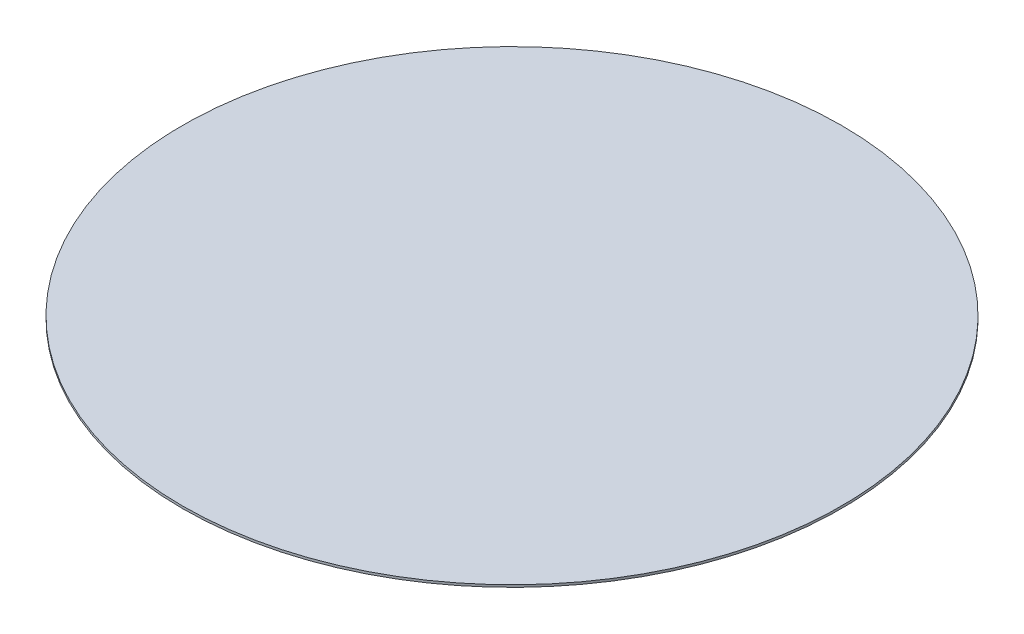
ISO-10303-21;
HEADER;
FILE_DESCRIPTION(('STEP AP214'),'2;1');
FILE_NAME('part.step','',(''),(''),'','','');
FILE_SCHEMA(('AUTOMOTIVE_DESIGN { 1 0 10303 214 1 1 1 1 }'));
ENDSEC;
DATA;
#1=APPLICATION_CONTEXT('core data for automotive mechanical design processes');
#2=APPLICATION_PROTOCOL_DEFINITION('international standard','automotive_design',2000,#1);
#3=PRODUCT_CONTEXT('',#1,'mechanical');
#4=PRODUCT('Part','Part','',(#3));
#5=PRODUCT_RELATED_PRODUCT_CATEGORY('part','',(#4));
#6=PRODUCT_DEFINITION_FORMATION('','',#4);
#7=PRODUCT_DEFINITION_CONTEXT('part definition',#1,'design');
#8=PRODUCT_DEFINITION('design','',#6,#7);
#9=PRODUCT_DEFINITION_SHAPE('','',#8);
#10=(LENGTH_UNIT() NAMED_UNIT(*) SI_UNIT(.MILLI.,.METRE.));
#11=(NAMED_UNIT(*) PLANE_ANGLE_UNIT() SI_UNIT($,.RADIAN.));
#12=(NAMED_UNIT(*) SI_UNIT($,.STERADIAN.) SOLID_ANGLE_UNIT());
#13=UNCERTAINTY_MEASURE_WITH_UNIT(LENGTH_MEASURE(1.E-05),#10,'distance_accuracy_value','');
#14=(GEOMETRIC_REPRESENTATION_CONTEXT(3) GLOBAL_UNCERTAINTY_ASSIGNED_CONTEXT((#13)) GLOBAL_UNIT_ASSIGNED_CONTEXT((#10,
#11,#12)) REPRESENTATION_CONTEXT('',''));
#15=CARTESIAN_POINT('',(0.,0.,0.));
#16=DIRECTION('',(0.,0.,1.));
#17=DIRECTION('',(1.,0.,0.));
#18=AXIS2_PLACEMENT_3D('',#15,#16,#17);
#19=CARTESIAN_POINT('',(0.,0.7,0.));
#20=DIRECTION('',(0.,-1.,0.));
#21=DIRECTION('',(0.,0.,-1.));
#22=AXIS2_PLACEMENT_3D('',#19,#20,#21);
#23=CYLINDRICAL_SURFACE('',#22,100.);
#24=CARTESIAN_POINT('',(0.,0.7,0.));
#25=DIRECTION('',(0.,1.,0.));
#26=DIRECTION('',(0.,0.,1.));
#27=AXIS2_PLACEMENT_3D('',#24,#25,#26);
#28=CIRCLE('',#27,100.);
#29=CARTESIAN_POINT('',(0.,0.7,100.));
#30=VERTEX_POINT('',#29);
#31=EDGE_CURVE('E10',#30,#30,#28,.T.);
#32=ORIENTED_EDGE('',*,*,#31,.F.);
#33=EDGE_LOOP('',(#32));
#34=FACE_BOUND('',#33,.T.);
#35=CARTESIAN_POINT('',(0.,0.,0.));
#36=DIRECTION('',(0.,1.,0.));
#37=DIRECTION('',(0.,0.,1.));
#38=AXIS2_PLACEMENT_3D('',#35,#36,#37);
#39=CIRCLE('',#38,100.);
#40=CARTESIAN_POINT('',(0.,0.,100.));
#41=VERTEX_POINT('',#40);
#42=EDGE_CURVE('E40',#41,#41,#39,.T.);
#43=ORIENTED_EDGE('',*,*,#42,.T.);
#44=EDGE_LOOP('',(#43));
#45=FACE_BOUND('',#44,.T.);
#46=ADVANCED_FACE('F37',(#34,#45),#23,.T.);
#47=CARTESIAN_POINT('',(0.,0.7,0.));
#48=DIRECTION('',(0.,1.,0.));
#49=DIRECTION('',(0.,0.,1.));
#50=AXIS2_PLACEMENT_3D('',#47,#48,#49);
#51=PLANE('',#50);
#52=ORIENTED_EDGE('',*,*,#31,.T.);
#53=EDGE_LOOP('',(#52));
#54=FACE_BOUND('',#53,.T.);
#55=ADVANCED_FACE('F52',(#54),#51,.T.);
#56=CARTESIAN_POINT('',(0.,0.,0.));
#57=DIRECTION('',(0.,1.,0.));
#58=DIRECTION('',(0.,0.,1.));
#59=AXIS2_PLACEMENT_3D('',#56,#57,#58);
#60=PLANE('',#59);
#61=ORIENTED_EDGE('',*,*,#42,.F.);
#62=EDGE_LOOP('',(#61));
#63=FACE_BOUND('',#62,.T.);
#64=ADVANCED_FACE('F50',(#63),#60,.F.);
#65=CLOSED_SHELL('',(#46,#55,#64));
#66=MANIFOLD_SOLID_BREP('B2',#65);
#67=ADVANCED_BREP_SHAPE_REPRESENTATION('',(#18,#66),#14);
#68=SHAPE_DEFINITION_REPRESENTATION(#9,#67);
ENDSEC;
END-ISO-10303-21;
